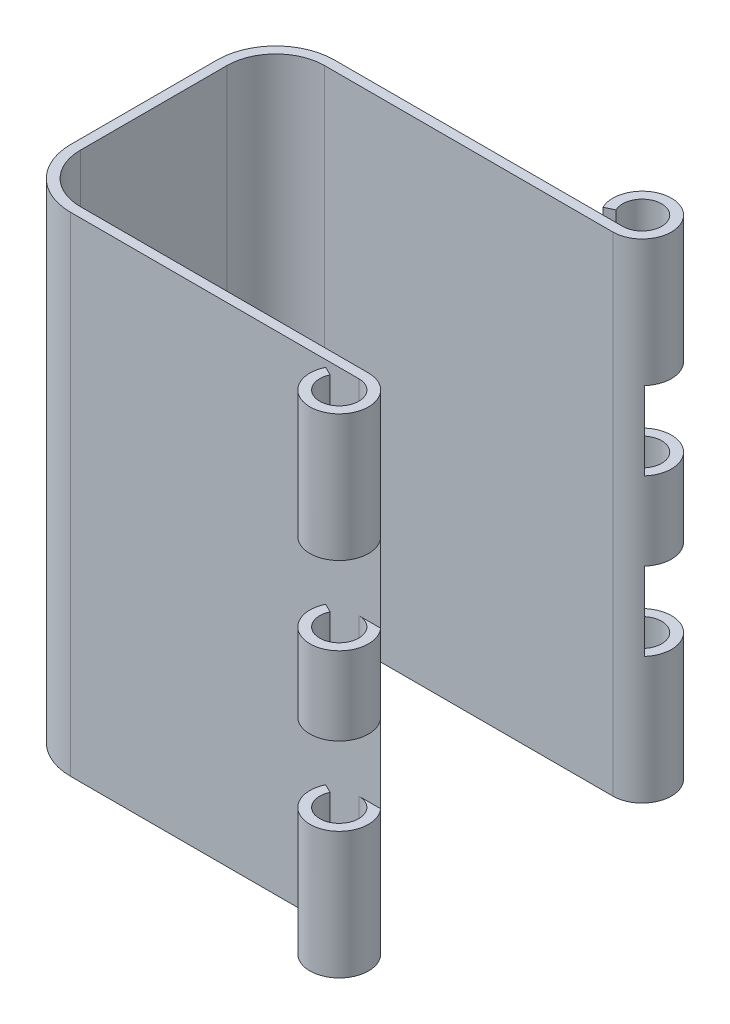
ISO-10303-21;
HEADER;
FILE_DESCRIPTION(('STEP AP214'),'2;1');
FILE_NAME('part.step','',(''),(''),'','','');
FILE_SCHEMA(('AUTOMOTIVE_DESIGN { 1 0 10303 214 1 1 1 1 }'));
ENDSEC;
DATA;
#1=APPLICATION_CONTEXT('core data for automotive mechanical design processes');
#2=APPLICATION_PROTOCOL_DEFINITION('international standard','automotive_design',2000,#1);
#3=PRODUCT_CONTEXT('',#1,'mechanical');
#4=PRODUCT('Part','Part','',(#3));
#5=PRODUCT_RELATED_PRODUCT_CATEGORY('part','',(#4));
#6=PRODUCT_DEFINITION_FORMATION('','',#4);
#7=PRODUCT_DEFINITION_CONTEXT('part definition',#1,'design');
#8=PRODUCT_DEFINITION('design','',#6,#7);
#9=PRODUCT_DEFINITION_SHAPE('','',#8);
#10=(LENGTH_UNIT() NAMED_UNIT(*) SI_UNIT(.MILLI.,.METRE.));
#11=(NAMED_UNIT(*) PLANE_ANGLE_UNIT() SI_UNIT($,.RADIAN.));
#12=(NAMED_UNIT(*) SI_UNIT($,.STERADIAN.) SOLID_ANGLE_UNIT());
#13=UNCERTAINTY_MEASURE_WITH_UNIT(LENGTH_MEASURE(1.E-05),#10,'distance_accuracy_value','');
#14=(GEOMETRIC_REPRESENTATION_CONTEXT(3) GLOBAL_UNCERTAINTY_ASSIGNED_CONTEXT((#13)) GLOBAL_UNIT_ASSIGNED_CONTEXT((#10,
#11,#12)) REPRESENTATION_CONTEXT('',''));
#15=CARTESIAN_POINT('',(0.,0.,0.));
#16=DIRECTION('',(0.,0.,1.));
#17=DIRECTION('',(1.,0.,0.));
#18=AXIS2_PLACEMENT_3D('',#15,#16,#17);
#19=CARTESIAN_POINT('',(8.763,12.7,3.937));
#20=DIRECTION('',(0.,-1.,0.));
#21=DIRECTION('',(0.,0.,-1.));
#22=AXIS2_PLACEMENT_3D('',#19,#20,#21);
#23=CYLINDRICAL_SURFACE('',#22,0.761999999999999);
#24=DIRECTION('',(0.,-1.,0.));
#25=VECTOR('',#24,1.);
#26=CARTESIAN_POINT('',(9.33096126628494,12.7,3.429));
#27=LINE('',#26,#25);
#28=CARTESIAN_POINT('',(9.33096126628494,9.398,3.429));
#29=VERTEX_POINT('',#28);
#30=CARTESIAN_POINT('',(9.33096126628494,7.366,3.429));
#31=VERTEX_POINT('',#30);
#32=EDGE_CURVE('E279',#29,#31,#27,.T.);
#33=ORIENTED_EDGE('',*,*,#32,.T.);
#34=CARTESIAN_POINT('',(8.763,7.366,3.937));
#35=DIRECTION('',(0.,1.,0.));
#36=DIRECTION('',(0.,0.,1.));
#37=AXIS2_PLACEMENT_3D('',#34,#35,#36);
#38=CIRCLE('',#37,0.761999999999999);
#39=CARTESIAN_POINT('',(8.07728874839081,7.366,3.60466872037595));
#40=VERTEX_POINT('',#39);
#41=EDGE_CURVE('E280',#31,#40,#38,.F.);
#42=ORIENTED_EDGE('',*,*,#41,.T.);
#43=DIRECTION('',(0.,-1.,0.));
#44=VECTOR('',#43,1.);
#45=CARTESIAN_POINT('',(8.07728874839081,12.7,3.60466872037595));
#46=LINE('',#45,#44);
#47=CARTESIAN_POINT('',(8.07728874839081,5.334,3.60466872037595));
#48=VERTEX_POINT('',#47);
#49=EDGE_CURVE('E475',#40,#48,#46,.T.);
#50=ORIENTED_EDGE('',*,*,#49,.T.);
#51=CARTESIAN_POINT('',(8.763,5.334,3.937));
#52=DIRECTION('',(0.,-1.,0.));
#53=DIRECTION('',(0.,0.,-1.));
#54=AXIS2_PLACEMENT_3D('',#51,#52,#53);
#55=CIRCLE('',#54,0.761999999999999);
#56=CARTESIAN_POINT('',(9.33096126628494,5.334,3.429));
#57=VERTEX_POINT('',#56);
#58=EDGE_CURVE('E277',#48,#57,#55,.F.);
#59=ORIENTED_EDGE('',*,*,#58,.T.);
#60=DIRECTION('',(0.,-1.,0.));
#61=VECTOR('',#60,1.);
#62=CARTESIAN_POINT('',(9.33096126628494,12.7,3.429));
#63=LINE('',#62,#61);
#64=CARTESIAN_POINT('',(9.33096126628494,3.302,3.429));
#65=VERTEX_POINT('',#64);
#66=EDGE_CURVE('E267',#57,#65,#63,.T.);
#67=ORIENTED_EDGE('',*,*,#66,.T.);
#68=CARTESIAN_POINT('',(8.763,3.302,3.937));
#69=DIRECTION('',(0.,1.,0.));
#70=DIRECTION('',(0.,0.,1.));
#71=AXIS2_PLACEMENT_3D('',#68,#69,#70);
#72=CIRCLE('',#71,0.761999999999999);
#73=CARTESIAN_POINT('',(8.07728874839081,3.302,3.60466872037595));
#74=VERTEX_POINT('',#73);
#75=EDGE_CURVE('E252',#65,#74,#72,.F.);
#76=ORIENTED_EDGE('',*,*,#75,.T.);
#77=CARTESIAN_POINT('',(8.07728874839081,0.,3.60466872037595));
#78=VERTEX_POINT('',#77);
#79=EDGE_CURVE('E410',#74,#78,#46,.T.);
#80=ORIENTED_EDGE('',*,*,#79,.T.);
#81=CARTESIAN_POINT('',(8.763,0.,3.937));
#82=DIRECTION('',(0.,1.,0.));
#83=DIRECTION('',(0.,0.,1.));
#84=AXIS2_PLACEMENT_3D('',#81,#82,#83);
#85=CIRCLE('',#84,0.761999999999999);
#86=CARTESIAN_POINT('',(8.763,0.,3.175));
#87=VERTEX_POINT('',#86);
#88=EDGE_CURVE('E352',#87,#78,#85,.F.);
#89=ORIENTED_EDGE('',*,*,#88,.F.);
#90=DIRECTION('',(0.,-1.,0.));
#91=VECTOR('',#90,1.);
#92=CARTESIAN_POINT('',(8.763,12.7,3.175));
#93=LINE('',#92,#91);
#94=CARTESIAN_POINT('',(8.763,12.7,3.175));
#95=VERTEX_POINT('',#94);
#96=EDGE_CURVE('E533',#95,#87,#93,.T.);
#97=ORIENTED_EDGE('',*,*,#96,.F.);
#98=CARTESIAN_POINT('',(8.763,12.7,3.937));
#99=DIRECTION('',(0.,1.,0.));
#100=DIRECTION('',(0.,0.,1.));
#101=AXIS2_PLACEMENT_3D('',#98,#99,#100);
#102=CIRCLE('',#101,0.761999999999999);
#103=CARTESIAN_POINT('',(8.07728874839081,12.7,3.60466872037595));
#104=VERTEX_POINT('',#103);
#105=EDGE_CURVE('E353',#95,#104,#102,.F.);
#106=ORIENTED_EDGE('',*,*,#105,.T.);
#107=CARTESIAN_POINT('',(8.07728874839081,9.398,3.60466872037595));
#108=VERTEX_POINT('',#107);
#109=EDGE_CURVE('E470',#104,#108,#46,.T.);
#110=ORIENTED_EDGE('',*,*,#109,.T.);
#111=CARTESIAN_POINT('',(8.763,9.398,3.937));
#112=DIRECTION('',(0.,-1.,0.));
#113=DIRECTION('',(0.,0.,-1.));
#114=AXIS2_PLACEMENT_3D('',#111,#112,#113);
#115=CIRCLE('',#114,0.761999999999999);
#116=EDGE_CURVE('E68',#108,#29,#115,.F.);
#117=ORIENTED_EDGE('',*,*,#116,.T.);
#118=EDGE_LOOP('',(#33,#42,#50,#59,#67,#76,#80,#89,#97,#106,#110,#117));
#119=FACE_BOUND('',#118,.T.);
#120=ADVANCED_FACE('F45',(#119),#23,.T.);
#121=CARTESIAN_POINT('',(8.763,12.7,3.937));
#122=DIRECTION('',(0.,-1.,0.));
#123=DIRECTION('',(0.,0.,-1.));
#124=AXIS2_PLACEMENT_3D('',#121,#122,#123);
#125=CYLINDRICAL_SURFACE('',#124,0.508);
#126=CARTESIAN_POINT('',(8.763,7.366,3.937));
#127=DIRECTION('',(0.,1.,0.));
#128=DIRECTION('',(0.,0.,1.));
#129=AXIS2_PLACEMENT_3D('',#126,#127,#128);
#130=CIRCLE('',#129,0.508);
#131=CARTESIAN_POINT('',(8.763,7.366,3.429));
#132=VERTEX_POINT('',#131);
#133=CARTESIAN_POINT('',(8.30585916559387,7.366,3.71544581358397));
#134=VERTEX_POINT('',#133);
#135=EDGE_CURVE('E287',#132,#134,#130,.F.);
#136=ORIENTED_EDGE('',*,*,#135,.F.);
#137=DIRECTION('',(0.,-1.,0.));
#138=VECTOR('',#137,1.);
#139=CARTESIAN_POINT('',(8.763,12.7,3.429));
#140=LINE('',#139,#138);
#141=CARTESIAN_POINT('',(8.763,5.334,3.429));
#142=VERTEX_POINT('',#141);
#143=EDGE_CURVE('E486',#132,#142,#140,.T.);
#144=ORIENTED_EDGE('',*,*,#143,.T.);
#145=CARTESIAN_POINT('',(8.763,5.334,3.937));
#146=DIRECTION('',(0.,-1.,0.));
#147=DIRECTION('',(0.,0.,-1.));
#148=AXIS2_PLACEMENT_3D('',#145,#146,#147);
#149=CIRCLE('',#148,0.508);
#150=CARTESIAN_POINT('',(8.30585916559387,5.334,3.71544581358397));
#151=VERTEX_POINT('',#150);
#152=EDGE_CURVE('E261',#151,#142,#149,.F.);
#153=ORIENTED_EDGE('',*,*,#152,.F.);
#154=DIRECTION('',(0.,-1.,0.));
#155=VECTOR('',#154,1.);
#156=CARTESIAN_POINT('',(8.30585916559387,12.7,3.71544581358397));
#157=LINE('',#156,#155);
#158=EDGE_CURVE('E480',#134,#151,#157,.T.);
#159=ORIENTED_EDGE('',*,*,#158,.F.);
#160=EDGE_LOOP('',(#136,#144,#153,#159));
#161=FACE_BOUND('',#160,.T.);
#162=ADVANCED_FACE('F595',(#161),#125,.F.);
#163=CARTESIAN_POINT('',(8.763,9.398,3.937));
#164=DIRECTION('',(0.,-1.,0.));
#165=DIRECTION('',(0.,0.,-1.));
#166=AXIS2_PLACEMENT_3D('',#163,#164,#165);
#167=CIRCLE('',#166,0.508);
#168=CARTESIAN_POINT('',(8.30585916559387,9.398,3.71544581358397));
#169=VERTEX_POINT('',#168);
#170=CARTESIAN_POINT('',(8.763,9.398,3.429));
#171=VERTEX_POINT('',#170);
#172=EDGE_CURVE('E543',#169,#171,#167,.F.);
#173=ORIENTED_EDGE('',*,*,#172,.F.);
#174=CARTESIAN_POINT('',(8.30585916559387,12.7,3.71544581358397));
#175=VERTEX_POINT('',#174);
#176=EDGE_CURVE('E476',#175,#169,#157,.T.);
#177=ORIENTED_EDGE('',*,*,#176,.F.);
#178=CARTESIAN_POINT('',(8.763,12.7,3.937));
#179=DIRECTION('',(0.,1.,0.));
#180=DIRECTION('',(0.,0.,1.));
#181=AXIS2_PLACEMENT_3D('',#178,#179,#180);
#182=CIRCLE('',#181,0.508);
#183=CARTESIAN_POINT('',(8.763,12.7,3.429));
#184=VERTEX_POINT('',#183);
#185=EDGE_CURVE('E404',#184,#175,#182,.F.);
#186=ORIENTED_EDGE('',*,*,#185,.F.);
#187=EDGE_CURVE('E481',#184,#171,#140,.T.);
#188=ORIENTED_EDGE('',*,*,#187,.T.);
#189=EDGE_LOOP('',(#173,#177,#186,#188));
#190=FACE_BOUND('',#189,.T.);
#191=ADVANCED_FACE('F549',(#190),#125,.F.);
#192=CARTESIAN_POINT('',(8.763,3.302,3.937));
#193=DIRECTION('',(0.,1.,0.));
#194=DIRECTION('',(0.,0.,1.));
#195=AXIS2_PLACEMENT_3D('',#192,#193,#194);
#196=CIRCLE('',#195,0.508);
#197=CARTESIAN_POINT('',(8.763,3.302,3.429));
#198=VERTEX_POINT('',#197);
#199=CARTESIAN_POINT('',(8.30585916559387,3.302,3.71544581358397));
#200=VERTEX_POINT('',#199);
#201=EDGE_CURVE('E60',#198,#200,#196,.F.);
#202=ORIENTED_EDGE('',*,*,#201,.F.);
#203=CARTESIAN_POINT('',(8.763,0.,3.429));
#204=VERTEX_POINT('',#203);
#205=EDGE_CURVE('E270',#198,#204,#140,.T.);
#206=ORIENTED_EDGE('',*,*,#205,.T.);
#207=CARTESIAN_POINT('',(8.763,0.,3.937));
#208=DIRECTION('',(0.,1.,0.));
#209=DIRECTION('',(0.,0.,1.));
#210=AXIS2_PLACEMENT_3D('',#207,#208,#209);
#211=CIRCLE('',#210,0.508);
#212=CARTESIAN_POINT('',(8.30585916559387,0.,3.71544581358397));
#213=VERTEX_POINT('',#212);
#214=EDGE_CURVE('E463',#204,#213,#211,.F.);
#215=ORIENTED_EDGE('',*,*,#214,.T.);
#216=EDGE_CURVE('E474',#200,#213,#157,.T.);
#217=ORIENTED_EDGE('',*,*,#216,.F.);
#218=EDGE_LOOP('',(#202,#206,#215,#217));
#219=FACE_BOUND('',#218,.T.);
#220=ADVANCED_FACE('F604',(#219),#125,.F.);
#221=CARTESIAN_POINT('',(0.121666502853427,12.7,-0.251038933334577));
#222=DIRECTION('',(-0.436130288220536,0.,0.899883532295526));
#223=DIRECTION('',(0.899883532295526,0.,0.436130288220536));
#224=AXIS2_PLACEMENT_3D('',#221,#222,#223);
#225=PLANE('',#224);
#226=DIRECTION('',(-0.899883532295526,0.,-0.436130288220536));
#227=VECTOR('',#226,1.);
#228=CARTESIAN_POINT('',(0.121666502853427,7.366,-0.251038933334577));
#229=LINE('',#228,#227);
#230=EDGE_CURVE('E11',#134,#40,#229,.T.);
#231=ORIENTED_EDGE('',*,*,#230,.F.);
#232=ORIENTED_EDGE('',*,*,#158,.T.);
#233=DIRECTION('',(0.899883532295526,0.,0.436130288220536));
#234=VECTOR('',#233,1.);
#235=CARTESIAN_POINT('',(0.121666502853426,5.334,-0.251038933334578));
#236=LINE('',#235,#234);
#237=EDGE_CURVE('E538',#48,#151,#236,.T.);
#238=ORIENTED_EDGE('',*,*,#237,.F.);
#239=ORIENTED_EDGE('',*,*,#49,.F.);
#240=EDGE_LOOP('',(#231,#232,#238,#239));
#241=FACE_BOUND('',#240,.T.);
#242=ADVANCED_FACE('F592',(#241),#225,.F.);
#243=DIRECTION('',(0.899883532295526,0.,0.436130288220536));
#244=VECTOR('',#243,1.);
#245=CARTESIAN_POINT('',(0.121666502853427,9.398,-0.251038933334577));
#246=LINE('',#245,#244);
#247=EDGE_CURVE('E53',#108,#169,#246,.T.);
#248=ORIENTED_EDGE('',*,*,#247,.F.);
#249=ORIENTED_EDGE('',*,*,#109,.F.);
#250=DIRECTION('',(-0.899883532295526,0.,-0.436130288220536));
#251=VECTOR('',#250,1.);
#252=CARTESIAN_POINT('',(0.121666502853427,12.7,-0.251038933334577));
#253=LINE('',#252,#251);
#254=EDGE_CURVE('E407',#175,#104,#253,.T.);
#255=ORIENTED_EDGE('',*,*,#254,.F.);
#256=ORIENTED_EDGE('',*,*,#176,.T.);
#257=EDGE_LOOP('',(#248,#249,#255,#256));
#258=FACE_BOUND('',#257,.T.);
#259=ADVANCED_FACE('F555',(#258),#225,.F.);
#260=DIRECTION('',(-0.899883532295526,0.,-0.436130288220536));
#261=VECTOR('',#260,1.);
#262=CARTESIAN_POINT('',(0.121666502853427,3.302,-0.251038933334577));
#263=LINE('',#262,#261);
#264=EDGE_CURVE('E256',#200,#74,#263,.T.);
#265=ORIENTED_EDGE('',*,*,#264,.F.);
#266=ORIENTED_EDGE('',*,*,#216,.T.);
#267=DIRECTION('',(-0.899883532295526,0.,-0.436130288220536));
#268=VECTOR('',#267,1.);
#269=CARTESIAN_POINT('',(0.121666502853427,0.,-0.251038933334577));
#270=LINE('',#269,#268);
#271=EDGE_CURVE('E358',#213,#78,#270,.T.);
#272=ORIENTED_EDGE('',*,*,#271,.T.);
#273=ORIENTED_EDGE('',*,*,#79,.F.);
#274=EDGE_LOOP('',(#265,#266,#272,#273));
#275=FACE_BOUND('',#274,.T.);
#276=ADVANCED_FACE('F600',(#275),#225,.F.);
#277=CARTESIAN_POINT('',(0.121666502853427,12.7,0.251038933334577));
#278=DIRECTION('',(0.436130288220536,0.,0.899883532295526));
#279=DIRECTION('',(0.899883532295526,0.,-0.436130288220536));
#280=AXIS2_PLACEMENT_3D('',#277,#278,#279);
#281=PLANE('',#280);
#282=DIRECTION('',(-0.899883532295526,0.,0.436130288220536));
#283=VECTOR('',#282,1.);
#284=CARTESIAN_POINT('',(0.121666502853427,9.398,0.251038933334577));
#285=LINE('',#284,#283);
#286=CARTESIAN_POINT('',(8.30585916559387,9.398,-3.71544581358397));
#287=VERTEX_POINT('',#286);
#288=CARTESIAN_POINT('',(8.07728874839081,9.398,-3.60466872037595));
#289=VERTEX_POINT('',#288);
#290=EDGE_CURVE('E345',#287,#289,#285,.T.);
#291=ORIENTED_EDGE('',*,*,#290,.F.);
#292=DIRECTION('',(0.,-1.,0.));
#293=VECTOR('',#292,1.);
#294=CARTESIAN_POINT('',(8.30585916559387,12.7,-3.71544581358397));
#295=LINE('',#294,#293);
#296=CARTESIAN_POINT('',(8.30585916559387,12.7,-3.71544581358397));
#297=VERTEX_POINT('',#296);
#298=EDGE_CURVE('E507',#297,#287,#295,.T.);
#299=ORIENTED_EDGE('',*,*,#298,.F.);
#300=DIRECTION('',(-0.899883532295526,0.,0.436130288220536));
#301=VECTOR('',#300,1.);
#302=CARTESIAN_POINT('',(0.121666502853427,12.7,0.251038933334577));
#303=LINE('',#302,#301);
#304=CARTESIAN_POINT('',(8.07728874839081,12.7,-3.60466872037595));
#305=VERTEX_POINT('',#304);
#306=EDGE_CURVE('E381',#297,#305,#303,.T.);
#307=ORIENTED_EDGE('',*,*,#306,.T.);
#308=DIRECTION('',(0.,-1.,0.));
#309=VECTOR('',#308,1.);
#310=CARTESIAN_POINT('',(8.07728874839081,12.7,-3.60466872037595));
#311=LINE('',#310,#309);
#312=EDGE_CURVE('E513',#305,#289,#311,.T.);
#313=ORIENTED_EDGE('',*,*,#312,.T.);
#314=EDGE_LOOP('',(#291,#299,#307,#313));
#315=FACE_BOUND('',#314,.T.);
#316=ADVANCED_FACE('F677',(#315),#281,.T.);
#317=DIRECTION('',(0.899883532295526,0.,-0.436130288220536));
#318=VECTOR('',#317,1.);
#319=CARTESIAN_POINT('',(0.121666502853427,3.302,0.251038933334577));
#320=LINE('',#319,#318);
#321=CARTESIAN_POINT('',(8.07728874839081,3.302,-3.60466872037595));
#322=VERTEX_POINT('',#321);
#323=CARTESIAN_POINT('',(8.30585916559387,3.302,-3.71544581358397));
#324=VERTEX_POINT('',#323);
#325=EDGE_CURVE('E317',#322,#324,#320,.T.);
#326=ORIENTED_EDGE('',*,*,#325,.F.);
#327=CARTESIAN_POINT('',(8.07728874839081,0.,-3.60466872037595));
#328=VERTEX_POINT('',#327);
#329=EDGE_CURVE('E511',#322,#328,#311,.T.);
#330=ORIENTED_EDGE('',*,*,#329,.T.);
#331=DIRECTION('',(-0.899883532295526,0.,0.436130288220536));
#332=VECTOR('',#331,1.);
#333=CARTESIAN_POINT('',(0.121666502853427,0.,0.251038933334577));
#334=LINE('',#333,#332);
#335=CARTESIAN_POINT('',(8.30585916559387,0.,-3.71544581358397));
#336=VERTEX_POINT('',#335);
#337=EDGE_CURVE('E438',#336,#328,#334,.T.);
#338=ORIENTED_EDGE('',*,*,#337,.F.);
#339=EDGE_CURVE('E505',#324,#336,#295,.T.);
#340=ORIENTED_EDGE('',*,*,#339,.F.);
#341=EDGE_LOOP('',(#326,#330,#338,#340));
#342=FACE_BOUND('',#341,.T.);
#343=ADVANCED_FACE('F681',(#342),#281,.T.);
#344=CARTESIAN_POINT('',(8.763,12.7,-3.937));
#345=DIRECTION('',(0.,-1.,0.));
#346=DIRECTION('',(0.,0.,-1.));
#347=AXIS2_PLACEMENT_3D('',#344,#345,#346);
#348=CYLINDRICAL_SURFACE('',#347,0.508);
#349=CARTESIAN_POINT('',(8.763,9.398,-3.937));
#350=DIRECTION('',(0.,1.,0.));
#351=DIRECTION('',(0.,0.,1.));
#352=AXIS2_PLACEMENT_3D('',#349,#350,#351);
#353=CIRCLE('',#352,0.508);
#354=CARTESIAN_POINT('',(8.763,9.398,-3.429));
#355=VERTEX_POINT('',#354);
#356=EDGE_CURVE('E342',#355,#287,#353,.T.);
#357=ORIENTED_EDGE('',*,*,#356,.F.);
#358=DIRECTION('',(0.,-1.,0.));
#359=VECTOR('',#358,1.);
#360=CARTESIAN_POINT('',(8.763,12.7,-3.429));
#361=LINE('',#360,#359);
#362=CARTESIAN_POINT('',(8.763,12.7,-3.429));
#363=VERTEX_POINT('',#362);
#364=EDGE_CURVE('E501',#363,#355,#361,.T.);
#365=ORIENTED_EDGE('',*,*,#364,.F.);
#366=CARTESIAN_POINT('',(8.763,12.7,-3.937));
#367=DIRECTION('',(0.,1.,0.));
#368=DIRECTION('',(0.,0.,1.));
#369=AXIS2_PLACEMENT_3D('',#366,#367,#368);
#370=CIRCLE('',#369,0.508);
#371=EDGE_CURVE('E385',#363,#297,#370,.T.);
#372=ORIENTED_EDGE('',*,*,#371,.T.);
#373=ORIENTED_EDGE('',*,*,#298,.T.);
#374=EDGE_LOOP('',(#357,#365,#372,#373));
#375=FACE_BOUND('',#374,.T.);
#376=ADVANCED_FACE('F687',(#375),#348,.F.);
#377=CARTESIAN_POINT('',(8.763,3.302,-3.937));
#378=DIRECTION('',(0.,-1.,0.));
#379=DIRECTION('',(0.,0.,-1.));
#380=AXIS2_PLACEMENT_3D('',#377,#378,#379);
#381=CIRCLE('',#380,0.508);
#382=CARTESIAN_POINT('',(8.763,3.302,-3.429));
#383=VERTEX_POINT('',#382);
#384=EDGE_CURVE('E314',#324,#383,#381,.T.);
#385=ORIENTED_EDGE('',*,*,#384,.F.);
#386=ORIENTED_EDGE('',*,*,#339,.T.);
#387=CARTESIAN_POINT('',(8.763,0.,-3.937));
#388=DIRECTION('',(0.,1.,0.));
#389=DIRECTION('',(0.,0.,1.));
#390=AXIS2_PLACEMENT_3D('',#387,#388,#389);
#391=CIRCLE('',#390,0.508);
#392=CARTESIAN_POINT('',(8.763,0.,-3.429));
#393=VERTEX_POINT('',#392);
#394=EDGE_CURVE('E442',#393,#336,#391,.T.);
#395=ORIENTED_EDGE('',*,*,#394,.F.);
#396=EDGE_CURVE('E500',#383,#393,#361,.T.);
#397=ORIENTED_EDGE('',*,*,#396,.F.);
#398=EDGE_LOOP('',(#385,#386,#395,#397));
#399=FACE_BOUND('',#398,.T.);
#400=ADVANCED_FACE('F697',(#399),#348,.F.);
#401=CARTESIAN_POINT('',(0.,12.7,3.175));
#402=DIRECTION('',(0.,0.,-1.));
#403=DIRECTION('',(-1.,0.,0.));
#404=AXIS2_PLACEMENT_3D('',#401,#402,#403);
#405=PLANE('',#404);
#406=DIRECTION('',(1.,0.,0.));
#407=VECTOR('',#406,1.);
#408=CARTESIAN_POINT('',(0.,0.,3.175));
#409=LINE('',#408,#407);
#410=CARTESIAN_POINT('',(1.27,0.,3.175));
#411=VERTEX_POINT('',#410);
#412=EDGE_CURVE('E414',#411,#87,#409,.T.);
#413=ORIENTED_EDGE('',*,*,#412,.F.);
#414=DIRECTION('',(0.,-1.,0.));
#415=VECTOR('',#414,1.);
#416=CARTESIAN_POINT('',(1.27,12.7,3.175));
#417=LINE('',#416,#415);
#418=CARTESIAN_POINT('',(1.27,12.7,3.175));
#419=VERTEX_POINT('',#418);
#420=EDGE_CURVE('E530',#419,#411,#417,.T.);
#421=ORIENTED_EDGE('',*,*,#420,.F.);
#422=DIRECTION('',(1.,0.,0.));
#423=VECTOR('',#422,1.);
#424=CARTESIAN_POINT('',(0.,12.7,3.175));
#425=LINE('',#424,#423);
#426=EDGE_CURVE('E357',#419,#95,#425,.T.);
#427=ORIENTED_EDGE('',*,*,#426,.T.);
#428=ORIENTED_EDGE('',*,*,#96,.T.);
#429=EDGE_LOOP('',(#413,#421,#427,#428));
#430=FACE_BOUND('',#429,.T.);
#431=ADVANCED_FACE('F715',(#430),#405,.T.);
#432=CARTESIAN_POINT('',(1.27,12.7,1.905));
#433=DIRECTION('',(0.,-1.,0.));
#434=DIRECTION('',(0.,0.,-1.));
#435=AXIS2_PLACEMENT_3D('',#432,#433,#434);
#436=CYLINDRICAL_SURFACE('',#435,1.27);
#437=CARTESIAN_POINT('',(1.27,0.,1.905));
#438=DIRECTION('',(0.,1.,0.));
#439=DIRECTION('',(0.,0.,1.));
#440=AXIS2_PLACEMENT_3D('',#437,#438,#439);
#441=CIRCLE('',#440,1.27);
#442=CARTESIAN_POINT('',(0.,0.,1.905));
#443=VERTEX_POINT('',#442);
#444=EDGE_CURVE('E418',#443,#411,#441,.T.);
#445=ORIENTED_EDGE('',*,*,#444,.F.);
#446=DIRECTION('',(0.,-1.,0.));
#447=VECTOR('',#446,1.);
#448=CARTESIAN_POINT('',(0.,12.7,1.905));
#449=LINE('',#448,#447);
#450=CARTESIAN_POINT('',(0.,12.7,1.905));
#451=VERTEX_POINT('',#450);
#452=EDGE_CURVE('E527',#451,#443,#449,.T.);
#453=ORIENTED_EDGE('',*,*,#452,.F.);
#454=CARTESIAN_POINT('',(1.27,12.7,1.905));
#455=DIRECTION('',(0.,1.,0.));
#456=DIRECTION('',(0.,0.,1.));
#457=AXIS2_PLACEMENT_3D('',#454,#455,#456);
#458=CIRCLE('',#457,1.27);
#459=EDGE_CURVE('E362',#451,#419,#458,.T.);
#460=ORIENTED_EDGE('',*,*,#459,.T.);
#461=ORIENTED_EDGE('',*,*,#420,.T.);
#462=EDGE_LOOP('',(#445,#453,#460,#461));
#463=FACE_BOUND('',#462,.T.);
#464=ADVANCED_FACE('F712',(#463),#436,.F.);
#465=CARTESIAN_POINT('',(0.,12.7,0.));
#466=DIRECTION('',(1.,0.,0.));
#467=DIRECTION('',(0.,0.,-1.));
#468=AXIS2_PLACEMENT_3D('',#465,#466,#467);
#469=PLANE('',#468);
#470=DIRECTION('',(0.,0.,1.));
#471=VECTOR('',#470,1.);
#472=CARTESIAN_POINT('',(0.,0.,0.));
#473=LINE('',#472,#471);
#474=CARTESIAN_POINT('',(0.,0.,-1.905));
#475=VERTEX_POINT('',#474);
#476=EDGE_CURVE('E422',#475,#443,#473,.T.);
#477=ORIENTED_EDGE('',*,*,#476,.F.);
#478=DIRECTION('',(0.,-1.,0.));
#479=VECTOR('',#478,1.);
#480=CARTESIAN_POINT('',(0.,12.7,-1.905));
#481=LINE('',#480,#479);
#482=CARTESIAN_POINT('',(0.,12.7,-1.905));
#483=VERTEX_POINT('',#482);
#484=EDGE_CURVE('E524',#483,#475,#481,.T.);
#485=ORIENTED_EDGE('',*,*,#484,.F.);
#486=DIRECTION('',(0.,0.,1.));
#487=VECTOR('',#486,1.);
#488=CARTESIAN_POINT('',(0.,12.7,0.));
#489=LINE('',#488,#487);
#490=EDGE_CURVE('E366',#483,#451,#489,.T.);
#491=ORIENTED_EDGE('',*,*,#490,.T.);
#492=ORIENTED_EDGE('',*,*,#452,.T.);
#493=EDGE_LOOP('',(#477,#485,#491,#492));
#494=FACE_BOUND('',#493,.T.);
#495=ADVANCED_FACE('F708',(#494),#469,.T.);
#496=CARTESIAN_POINT('',(1.27,12.7,-1.905));
#497=DIRECTION('',(0.,-1.,0.));
#498=DIRECTION('',(0.,0.,-1.));
#499=AXIS2_PLACEMENT_3D('',#496,#497,#498);
#500=CYLINDRICAL_SURFACE('',#499,1.27);
#501=CARTESIAN_POINT('',(1.27,0.,-1.905));
#502=DIRECTION('',(0.,1.,0.));
#503=DIRECTION('',(0.,0.,1.));
#504=AXIS2_PLACEMENT_3D('',#501,#502,#503);
#505=CIRCLE('',#504,1.27);
#506=CARTESIAN_POINT('',(1.27,0.,-3.175));
#507=VERTEX_POINT('',#506);
#508=EDGE_CURVE('E426',#507,#475,#505,.T.);
#509=ORIENTED_EDGE('',*,*,#508,.F.);
#510=DIRECTION('',(0.,-1.,0.));
#511=VECTOR('',#510,1.);
#512=CARTESIAN_POINT('',(1.27,12.7,-3.175));
#513=LINE('',#512,#511);
#514=CARTESIAN_POINT('',(1.27,12.7,-3.175));
#515=VERTEX_POINT('',#514);
#516=EDGE_CURVE('E521',#515,#507,#513,.T.);
#517=ORIENTED_EDGE('',*,*,#516,.F.);
#518=CARTESIAN_POINT('',(1.27,12.7,-1.905));
#519=DIRECTION('',(0.,1.,0.));
#520=DIRECTION('',(0.,0.,1.));
#521=AXIS2_PLACEMENT_3D('',#518,#519,#520);
#522=CIRCLE('',#521,1.27);
#523=EDGE_CURVE('E370',#515,#483,#522,.T.);
#524=ORIENTED_EDGE('',*,*,#523,.T.);
#525=ORIENTED_EDGE('',*,*,#484,.T.);
#526=EDGE_LOOP('',(#509,#517,#524,#525));
#527=FACE_BOUND('',#526,.T.);
#528=ADVANCED_FACE('F702',(#527),#500,.F.);
#529=CARTESIAN_POINT('',(0.,12.7,-3.175));
#530=DIRECTION('',(0.,0.,1.));
#531=DIRECTION('',(1.,0.,0.));
#532=AXIS2_PLACEMENT_3D('',#529,#530,#531);
#533=PLANE('',#532);
#534=DIRECTION('',(-1.,0.,0.));
#535=VECTOR('',#534,1.);
#536=CARTESIAN_POINT('',(0.,0.,-3.175));
#537=LINE('',#536,#535);
#538=CARTESIAN_POINT('',(8.763,0.,-3.175));
#539=VERTEX_POINT('',#538);
#540=EDGE_CURVE('E430',#539,#507,#537,.T.);
#541=ORIENTED_EDGE('',*,*,#540,.F.);
#542=DIRECTION('',(0.,-1.,0.));
#543=VECTOR('',#542,1.);
#544=CARTESIAN_POINT('',(8.763,12.7,-3.175));
#545=LINE('',#544,#543);
#546=CARTESIAN_POINT('',(8.763,12.7,-3.175));
#547=VERTEX_POINT('',#546);
#548=EDGE_CURVE('E517',#547,#539,#545,.T.);
#549=ORIENTED_EDGE('',*,*,#548,.F.);
#550=DIRECTION('',(-1.,0.,0.));
#551=VECTOR('',#550,1.);
#552=CARTESIAN_POINT('',(0.,12.7,-3.175));
#553=LINE('',#552,#551);
#554=EDGE_CURVE('E374',#547,#515,#553,.T.);
#555=ORIENTED_EDGE('',*,*,#554,.T.);
#556=ORIENTED_EDGE('',*,*,#516,.T.);
#557=EDGE_LOOP('',(#541,#549,#555,#556));
#558=FACE_BOUND('',#557,.T.);
#559=ADVANCED_FACE('F698',(#558),#533,.T.);
#560=CARTESIAN_POINT('',(8.763,12.7,-3.937));
#561=DIRECTION('',(0.,-1.,0.));
#562=DIRECTION('',(0.,0.,-1.));
#563=AXIS2_PLACEMENT_3D('',#560,#561,#562);
#564=CYLINDRICAL_SURFACE('',#563,0.761999999999999);
#565=DIRECTION('',(0.,-1.,0.));
#566=VECTOR('',#565,1.);
#567=CARTESIAN_POINT('',(9.33096126628495,12.7,-3.429));
#568=LINE('',#567,#566);
#569=CARTESIAN_POINT('',(9.33096126628495,7.366,-3.429));
#570=VERTEX_POINT('',#569);
#571=CARTESIAN_POINT('',(9.33096126628495,9.398,-3.429));
#572=VERTEX_POINT('',#571);
#573=EDGE_CURVE('E338',#570,#572,#568,.F.);
#574=ORIENTED_EDGE('',*,*,#573,.T.);
#575=CARTESIAN_POINT('',(8.763,9.398,-3.937));
#576=DIRECTION('',(0.,1.,0.));
#577=DIRECTION('',(0.,0.,1.));
#578=AXIS2_PLACEMENT_3D('',#575,#576,#577);
#579=CIRCLE('',#578,0.761999999999999);
#580=EDGE_CURVE('E348',#572,#289,#579,.T.);
#581=ORIENTED_EDGE('',*,*,#580,.T.);
#582=ORIENTED_EDGE('',*,*,#312,.F.);
#583=CARTESIAN_POINT('',(8.763,12.7,-3.937));
#584=DIRECTION('',(0.,1.,0.));
#585=DIRECTION('',(0.,0.,1.));
#586=AXIS2_PLACEMENT_3D('',#583,#584,#585);
#587=CIRCLE('',#586,0.761999999999999);
#588=EDGE_CURVE('E378',#547,#305,#587,.T.);
#589=ORIENTED_EDGE('',*,*,#588,.F.);
#590=ORIENTED_EDGE('',*,*,#548,.T.);
#591=CARTESIAN_POINT('',(8.763,0.,-3.937));
#592=DIRECTION('',(0.,1.,0.));
#593=DIRECTION('',(0.,0.,1.));
#594=AXIS2_PLACEMENT_3D('',#591,#592,#593);
#595=CIRCLE('',#594,0.761999999999999);
#596=EDGE_CURVE('E434',#539,#328,#595,.T.);
#597=ORIENTED_EDGE('',*,*,#596,.T.);
#598=ORIENTED_EDGE('',*,*,#329,.F.);
#599=CARTESIAN_POINT('',(8.763,3.302,-3.937));
#600=DIRECTION('',(0.,-1.,0.));
#601=DIRECTION('',(0.,0.,-1.));
#602=AXIS2_PLACEMENT_3D('',#599,#600,#601);
#603=CIRCLE('',#602,0.761999999999999);
#604=CARTESIAN_POINT('',(9.33096126628495,3.302,-3.429));
#605=VERTEX_POINT('',#604);
#606=EDGE_CURVE('E320',#322,#605,#603,.T.);
#607=ORIENTED_EDGE('',*,*,#606,.T.);
#608=DIRECTION('',(0.,-1.,0.));
#609=VECTOR('',#608,1.);
#610=CARTESIAN_POINT('',(9.33096126628495,12.7,-3.429));
#611=LINE('',#610,#609);
#612=CARTESIAN_POINT('',(9.33096126628495,5.334,-3.429));
#613=VERTEX_POINT('',#612);
#614=EDGE_CURVE('E324',#605,#613,#611,.F.);
#615=ORIENTED_EDGE('',*,*,#614,.T.);
#616=CARTESIAN_POINT('',(8.763,5.334,-3.937));
#617=DIRECTION('',(0.,1.,0.));
#618=DIRECTION('',(0.,0.,1.));
#619=AXIS2_PLACEMENT_3D('',#616,#617,#618);
#620=CIRCLE('',#619,0.761999999999999);
#621=CARTESIAN_POINT('',(8.07728874839081,5.334,-3.60466872037595));
#622=VERTEX_POINT('',#621);
#623=EDGE_CURVE('E310',#613,#622,#620,.T.);
#624=ORIENTED_EDGE('',*,*,#623,.T.);
#625=CARTESIAN_POINT('',(8.07728874839081,7.366,-3.60466872037595));
#626=VERTEX_POINT('',#625);
#627=EDGE_CURVE('E518',#626,#622,#311,.T.);
#628=ORIENTED_EDGE('',*,*,#627,.F.);
#629=CARTESIAN_POINT('',(8.763,7.366,-3.937));
#630=DIRECTION('',(0.,-1.,0.));
#631=DIRECTION('',(0.,0.,-1.));
#632=AXIS2_PLACEMENT_3D('',#629,#630,#631);
#633=CIRCLE('',#632,0.761999999999999);
#634=EDGE_CURVE('E334',#626,#570,#633,.T.);
#635=ORIENTED_EDGE('',*,*,#634,.T.);
#636=EDGE_LOOP('',(#574,#581,#582,#589,#590,#597,#598,#607,#615,#624,#628,#635));
#637=FACE_BOUND('',#636,.T.);
#638=ADVANCED_FACE('F630',(#637),#564,.T.);
#639=DIRECTION('',(0.899883532295526,0.,-0.436130288220536));
#640=VECTOR('',#639,1.);
#641=CARTESIAN_POINT('',(0.121666502853427,7.366,0.251038933334577));
#642=LINE('',#641,#640);
#643=CARTESIAN_POINT('',(8.30585916559387,7.366,-3.71544581358397));
#644=VERTEX_POINT('',#643);
#645=EDGE_CURVE('E331',#626,#644,#642,.T.);
#646=ORIENTED_EDGE('',*,*,#645,.F.);
#647=ORIENTED_EDGE('',*,*,#627,.T.);
#648=DIRECTION('',(-0.899883532295526,0.,0.436130288220536));
#649=VECTOR('',#648,1.);
#650=CARTESIAN_POINT('',(0.121666502853426,5.334,0.251038933334578));
#651=LINE('',#650,#649);
#652=CARTESIAN_POINT('',(8.30585916559387,5.334,-3.71544581358397));
#653=VERTEX_POINT('',#652);
#654=EDGE_CURVE('E307',#653,#622,#651,.T.);
#655=ORIENTED_EDGE('',*,*,#654,.F.);
#656=EDGE_CURVE('E512',#644,#653,#295,.T.);
#657=ORIENTED_EDGE('',*,*,#656,.F.);
#658=EDGE_LOOP('',(#646,#647,#655,#657));
#659=FACE_BOUND('',#658,.T.);
#660=ADVANCED_FACE('F627',(#659),#281,.T.);
#661=CARTESIAN_POINT('',(8.763,7.366,-3.937));
#662=DIRECTION('',(0.,-1.,0.));
#663=DIRECTION('',(0.,0.,-1.));
#664=AXIS2_PLACEMENT_3D('',#661,#662,#663);
#665=CIRCLE('',#664,0.508);
#666=CARTESIAN_POINT('',(8.763,7.366,-3.429));
#667=VERTEX_POINT('',#666);
#668=EDGE_CURVE('E328',#644,#667,#665,.T.);
#669=ORIENTED_EDGE('',*,*,#668,.F.);
#670=ORIENTED_EDGE('',*,*,#656,.T.);
#671=CARTESIAN_POINT('',(8.763,5.334,-3.937));
#672=DIRECTION('',(0.,1.,0.));
#673=DIRECTION('',(0.,0.,1.));
#674=AXIS2_PLACEMENT_3D('',#671,#672,#673);
#675=CIRCLE('',#674,0.508);
#676=CARTESIAN_POINT('',(8.763,5.334,-3.429));
#677=VERTEX_POINT('',#676);
#678=EDGE_CURVE('E294',#677,#653,#675,.T.);
#679=ORIENTED_EDGE('',*,*,#678,.F.);
#680=EDGE_CURVE('E506',#667,#677,#361,.T.);
#681=ORIENTED_EDGE('',*,*,#680,.F.);
#682=EDGE_LOOP('',(#669,#670,#679,#681));
#683=FACE_BOUND('',#682,.T.);
#684=ADVANCED_FACE('F642',(#683),#348,.F.);
#685=CARTESIAN_POINT('',(0.,12.7,-3.429));
#686=DIRECTION('',(0.,0.,1.));
#687=DIRECTION('',(1.,0.,0.));
#688=AXIS2_PLACEMENT_3D('',#685,#686,#687);
#689=PLANE('',#688);
#690=DIRECTION('',(-1.,0.,0.));
#691=VECTOR('',#690,1.);
#692=CARTESIAN_POINT('',(0.,0.,-3.429));
#693=LINE('',#692,#691);
#694=CARTESIAN_POINT('',(1.27,0.,-3.429));
#695=VERTEX_POINT('',#694);
#696=EDGE_CURVE('E446',#393,#695,#693,.T.);
#697=ORIENTED_EDGE('',*,*,#696,.T.);
#698=DIRECTION('',(0.,-1.,0.));
#699=VECTOR('',#698,1.);
#700=CARTESIAN_POINT('',(1.27,12.7,-3.429));
#701=LINE('',#700,#699);
#702=CARTESIAN_POINT('',(1.27,12.7,-3.429));
#703=VERTEX_POINT('',#702);
#704=EDGE_CURVE('E497',#703,#695,#701,.T.);
#705=ORIENTED_EDGE('',*,*,#704,.F.);
#706=DIRECTION('',(-1.,0.,0.));
#707=VECTOR('',#706,1.);
#708=CARTESIAN_POINT('',(0.,12.7,-3.429));
#709=LINE('',#708,#707);
#710=EDGE_CURVE('E389',#363,#703,#709,.T.);
#711=ORIENTED_EDGE('',*,*,#710,.F.);
#712=ORIENTED_EDGE('',*,*,#364,.T.);
#713=DIRECTION('',(-1.,0.,0.));
#714=VECTOR('',#713,1.);
#715=CARTESIAN_POINT('',(12.446,9.398,-3.429));
#716=LINE('',#715,#714);
#717=EDGE_CURVE('E291',#572,#355,#716,.T.);
#718=ORIENTED_EDGE('',*,*,#717,.F.);
#719=ORIENTED_EDGE('',*,*,#573,.F.);
#720=DIRECTION('',(-1.,0.,0.));
#721=VECTOR('',#720,1.);
#722=CARTESIAN_POINT('',(12.446,7.366,-3.429));
#723=LINE('',#722,#721);
#724=EDGE_CURVE('E295',#570,#667,#723,.T.);
#725=ORIENTED_EDGE('',*,*,#724,.T.);
#726=ORIENTED_EDGE('',*,*,#680,.T.);
#727=DIRECTION('',(-1.,0.,0.));
#728=VECTOR('',#727,1.);
#729=CARTESIAN_POINT('',(12.446,5.334,-3.429));
#730=LINE('',#729,#728);
#731=EDGE_CURVE('E284',#613,#677,#730,.T.);
#732=ORIENTED_EDGE('',*,*,#731,.F.);
#733=ORIENTED_EDGE('',*,*,#614,.F.);
#734=DIRECTION('',(-1.,0.,0.));
#735=VECTOR('',#734,1.);
#736=CARTESIAN_POINT('',(12.446,3.302,-3.429));
#737=LINE('',#736,#735);
#738=EDGE_CURVE('E299',#605,#383,#737,.T.);
#739=ORIENTED_EDGE('',*,*,#738,.T.);
#740=ORIENTED_EDGE('',*,*,#396,.T.);
#741=EDGE_LOOP('',(#697,#705,#711,#712,#718,#719,#725,#726,#732,#733,#739,#740));
#742=FACE_BOUND('',#741,.T.);
#743=ADVANCED_FACE('F636',(#742),#689,.F.);
#744=CARTESIAN_POINT('',(1.27,12.7,-1.905));
#745=DIRECTION('',(0.,-1.,0.));
#746=DIRECTION('',(0.,0.,-1.));
#747=AXIS2_PLACEMENT_3D('',#744,#745,#746);
#748=CYLINDRICAL_SURFACE('',#747,1.524);
#749=CARTESIAN_POINT('',(1.27,0.,-1.905));
#750=DIRECTION('',(0.,1.,0.));
#751=DIRECTION('',(0.,0.,1.));
#752=AXIS2_PLACEMENT_3D('',#749,#750,#751);
#753=CIRCLE('',#752,1.524);
#754=CARTESIAN_POINT('',(-0.254,0.,-1.905));
#755=VERTEX_POINT('',#754);
#756=EDGE_CURVE('E450',#695,#755,#753,.T.);
#757=ORIENTED_EDGE('',*,*,#756,.T.);
#758=DIRECTION('',(0.,-1.,0.));
#759=VECTOR('',#758,1.);
#760=CARTESIAN_POINT('',(-0.254,12.7,-1.905));
#761=LINE('',#760,#759);
#762=CARTESIAN_POINT('',(-0.254,12.7,-1.905));
#763=VERTEX_POINT('',#762);
#764=EDGE_CURVE('E493',#763,#755,#761,.T.);
#765=ORIENTED_EDGE('',*,*,#764,.F.);
#766=CARTESIAN_POINT('',(1.27,12.7,-1.905));
#767=DIRECTION('',(0.,1.,0.));
#768=DIRECTION('',(0.,0.,1.));
#769=AXIS2_PLACEMENT_3D('',#766,#767,#768);
#770=CIRCLE('',#769,1.524);
#771=EDGE_CURVE('E392',#703,#763,#770,.T.);
#772=ORIENTED_EDGE('',*,*,#771,.F.);
#773=ORIENTED_EDGE('',*,*,#704,.T.);
#774=EDGE_LOOP('',(#757,#765,#772,#773));
#775=FACE_BOUND('',#774,.T.);
#776=ADVANCED_FACE('F746',(#775),#748,.T.);
#777=CARTESIAN_POINT('',(-0.254,12.7,0.));
#778=DIRECTION('',(1.,0.,0.));
#779=DIRECTION('',(0.,0.,-1.));
#780=AXIS2_PLACEMENT_3D('',#777,#778,#779);
#781=PLANE('',#780);
#782=DIRECTION('',(0.,0.,1.));
#783=VECTOR('',#782,1.);
#784=CARTESIAN_POINT('',(-0.254,0.,0.));
#785=LINE('',#784,#783);
#786=CARTESIAN_POINT('',(-0.254,0.,1.905));
#787=VERTEX_POINT('',#786);
#788=EDGE_CURVE('E453',#755,#787,#785,.T.);
#789=ORIENTED_EDGE('',*,*,#788,.T.);
#790=DIRECTION('',(0.,-1.,0.));
#791=VECTOR('',#790,1.);
#792=CARTESIAN_POINT('',(-0.254,12.7,1.905));
#793=LINE('',#792,#791);
#794=CARTESIAN_POINT('',(-0.254,12.7,1.905));
#795=VERTEX_POINT('',#794);
#796=EDGE_CURVE('E489',#795,#787,#793,.T.);
#797=ORIENTED_EDGE('',*,*,#796,.F.);
#798=DIRECTION('',(0.,0.,1.));
#799=VECTOR('',#798,1.);
#800=CARTESIAN_POINT('',(-0.254,12.7,0.));
#801=LINE('',#800,#799);
#802=EDGE_CURVE('E395',#763,#795,#801,.T.);
#803=ORIENTED_EDGE('',*,*,#802,.F.);
#804=ORIENTED_EDGE('',*,*,#764,.T.);
#805=EDGE_LOOP('',(#789,#797,#803,#804));
#806=FACE_BOUND('',#805,.T.);
#807=ADVANCED_FACE('F750',(#806),#781,.F.);
#808=CARTESIAN_POINT('',(1.27,12.7,1.905));
#809=DIRECTION('',(0.,-1.,0.));
#810=DIRECTION('',(0.,0.,-1.));
#811=AXIS2_PLACEMENT_3D('',#808,#809,#810);
#812=CYLINDRICAL_SURFACE('',#811,1.524);
#813=CARTESIAN_POINT('',(1.27,0.,1.905));
#814=DIRECTION('',(0.,1.,0.));
#815=DIRECTION('',(0.,0.,1.));
#816=AXIS2_PLACEMENT_3D('',#813,#814,#815);
#817=CIRCLE('',#816,1.524);
#818=CARTESIAN_POINT('',(1.27,0.,3.429));
#819=VERTEX_POINT('',#818);
#820=EDGE_CURVE('E456',#787,#819,#817,.T.);
#821=ORIENTED_EDGE('',*,*,#820,.T.);
#822=DIRECTION('',(0.,-1.,0.));
#823=VECTOR('',#822,1.);
#824=CARTESIAN_POINT('',(1.27,12.7,3.429));
#825=LINE('',#824,#823);
#826=CARTESIAN_POINT('',(1.27,12.7,3.429));
#827=VERTEX_POINT('',#826);
#828=EDGE_CURVE('E485',#827,#819,#825,.T.);
#829=ORIENTED_EDGE('',*,*,#828,.F.);
#830=CARTESIAN_POINT('',(1.27,12.7,1.905));
#831=DIRECTION('',(0.,1.,0.));
#832=DIRECTION('',(0.,0.,1.));
#833=AXIS2_PLACEMENT_3D('',#830,#831,#832);
#834=CIRCLE('',#833,1.524);
#835=EDGE_CURVE('E398',#795,#827,#834,.T.);
#836=ORIENTED_EDGE('',*,*,#835,.F.);
#837=ORIENTED_EDGE('',*,*,#796,.T.);
#838=EDGE_LOOP('',(#821,#829,#836,#837));
#839=FACE_BOUND('',#838,.T.);
#840=ADVANCED_FACE('F753',(#839),#812,.T.);
#841=CARTESIAN_POINT('',(0.,12.7,3.429));
#842=DIRECTION('',(0.,0.,-1.));
#843=DIRECTION('',(-1.,0.,0.));
#844=AXIS2_PLACEMENT_3D('',#841,#842,#843);
#845=PLANE('',#844);
#846=ORIENTED_EDGE('',*,*,#828,.T.);
#847=DIRECTION('',(1.,0.,0.));
#848=VECTOR('',#847,1.);
#849=CARTESIAN_POINT('',(0.,0.,3.429));
#850=LINE('',#849,#848);
#851=EDGE_CURVE('E460',#819,#204,#850,.T.);
#852=ORIENTED_EDGE('',*,*,#851,.T.);
#853=ORIENTED_EDGE('',*,*,#205,.F.);
#854=DIRECTION('',(-1.,0.,0.));
#855=VECTOR('',#854,1.);
#856=CARTESIAN_POINT('',(12.446,3.302,3.429));
#857=LINE('',#856,#855);
#858=EDGE_CURVE('E255',#65,#198,#857,.T.);
#859=ORIENTED_EDGE('',*,*,#858,.F.);
#860=ORIENTED_EDGE('',*,*,#66,.F.);
#861=DIRECTION('',(-1.,0.,0.));
#862=VECTOR('',#861,1.);
#863=CARTESIAN_POINT('',(12.446,5.334,3.429));
#864=LINE('',#863,#862);
#865=EDGE_CURVE('E272',#57,#142,#864,.T.);
#866=ORIENTED_EDGE('',*,*,#865,.T.);
#867=ORIENTED_EDGE('',*,*,#143,.F.);
#868=DIRECTION('',(-1.,0.,0.));
#869=VECTOR('',#868,1.);
#870=CARTESIAN_POINT('',(12.446,7.366,3.429));
#871=LINE('',#870,#869);
#872=EDGE_CURVE('E566',#31,#132,#871,.T.);
#873=ORIENTED_EDGE('',*,*,#872,.F.);
#874=ORIENTED_EDGE('',*,*,#32,.F.);
#875=DIRECTION('',(-1.,0.,0.));
#876=VECTOR('',#875,1.);
#877=CARTESIAN_POINT('',(12.446,9.398,3.429));
#878=LINE('',#877,#876);
#879=EDGE_CURVE('E563',#29,#171,#878,.T.);
#880=ORIENTED_EDGE('',*,*,#879,.T.);
#881=ORIENTED_EDGE('',*,*,#187,.F.);
#882=DIRECTION('',(1.,0.,0.));
#883=VECTOR('',#882,1.);
#884=CARTESIAN_POINT('',(0.,12.7,3.429));
#885=LINE('',#884,#883);
#886=EDGE_CURVE('E401',#827,#184,#885,.T.);
#887=ORIENTED_EDGE('',*,*,#886,.F.);
#888=EDGE_LOOP('',(#846,#852,#853,#859,#860,#866,#867,#873,#874,#880,#881,#887));
#889=FACE_BOUND('',#888,.T.);
#890=ADVANCED_FACE('F265',(#889),#845,.F.);
#891=CARTESIAN_POINT('',(0.,12.7,0.));
#892=DIRECTION('',(0.,1.,0.));
#893=DIRECTION('',(0.,0.,1.));
#894=AXIS2_PLACEMENT_3D('',#891,#892,#893);
#895=PLANE('',#894);
#896=ORIENTED_EDGE('',*,*,#105,.F.);
#897=ORIENTED_EDGE('',*,*,#426,.F.);
#898=ORIENTED_EDGE('',*,*,#459,.F.);
#899=ORIENTED_EDGE('',*,*,#490,.F.);
#900=ORIENTED_EDGE('',*,*,#523,.F.);
#901=ORIENTED_EDGE('',*,*,#554,.F.);
#902=ORIENTED_EDGE('',*,*,#588,.T.);
#903=ORIENTED_EDGE('',*,*,#306,.F.);
#904=ORIENTED_EDGE('',*,*,#371,.F.);
#905=ORIENTED_EDGE('',*,*,#710,.T.);
#906=ORIENTED_EDGE('',*,*,#771,.T.);
#907=ORIENTED_EDGE('',*,*,#802,.T.);
#908=ORIENTED_EDGE('',*,*,#835,.T.);
#909=ORIENTED_EDGE('',*,*,#886,.T.);
#910=ORIENTED_EDGE('',*,*,#185,.T.);
#911=ORIENTED_EDGE('',*,*,#254,.T.);
#912=EDGE_LOOP('',(#896,#897,#898,#899,#900,#901,#902,#903,#904,#905,#906,#907,#908,#909,#910,#911));
#913=FACE_BOUND('',#912,.T.);
#914=ADVANCED_FACE('F558',(#913),#895,.T.);
#915=CARTESIAN_POINT('',(0.,0.,0.));
#916=DIRECTION('',(0.,1.,0.));
#917=DIRECTION('',(0.,0.,1.));
#918=AXIS2_PLACEMENT_3D('',#915,#916,#917);
#919=PLANE('',#918);
#920=ORIENTED_EDGE('',*,*,#88,.T.);
#921=ORIENTED_EDGE('',*,*,#271,.F.);
#922=ORIENTED_EDGE('',*,*,#214,.F.);
#923=ORIENTED_EDGE('',*,*,#851,.F.);
#924=ORIENTED_EDGE('',*,*,#820,.F.);
#925=ORIENTED_EDGE('',*,*,#788,.F.);
#926=ORIENTED_EDGE('',*,*,#756,.F.);
#927=ORIENTED_EDGE('',*,*,#696,.F.);
#928=ORIENTED_EDGE('',*,*,#394,.T.);
#929=ORIENTED_EDGE('',*,*,#337,.T.);
#930=ORIENTED_EDGE('',*,*,#596,.F.);
#931=ORIENTED_EDGE('',*,*,#540,.T.);
#932=ORIENTED_EDGE('',*,*,#508,.T.);
#933=ORIENTED_EDGE('',*,*,#476,.T.);
#934=ORIENTED_EDGE('',*,*,#444,.T.);
#935=ORIENTED_EDGE('',*,*,#412,.T.);
#936=EDGE_LOOP('',(#920,#921,#922,#923,#924,#925,#926,#927,#928,#929,#930,#931,#932,#933,#934,#935));
#937=FACE_BOUND('',#936,.T.);
#938=ADVANCED_FACE('F607',(#937),#919,.F.);
#939=CARTESIAN_POINT('',(12.446,3.302,-3.429));
#940=DIRECTION('',(0.,-1.,0.));
#941=DIRECTION('',(0.,0.,-1.));
#942=AXIS2_PLACEMENT_3D('',#939,#940,#941);
#943=PLANE('',#942);
#944=ORIENTED_EDGE('',*,*,#325,.T.);
#945=ORIENTED_EDGE('',*,*,#384,.T.);
#946=ORIENTED_EDGE('',*,*,#738,.F.);
#947=ORIENTED_EDGE('',*,*,#606,.F.);
#948=EDGE_LOOP('',(#944,#945,#946,#947));
#949=FACE_BOUND('',#948,.T.);
#950=ADVANCED_FACE('F763',(#949),#943,.F.);
#951=CARTESIAN_POINT('',(12.446,5.334,-3.429));
#952=DIRECTION('',(0.,1.,0.));
#953=DIRECTION('',(0.,0.,1.));
#954=AXIS2_PLACEMENT_3D('',#951,#952,#953);
#955=PLANE('',#954);
#956=ORIENTED_EDGE('',*,*,#731,.T.);
#957=ORIENTED_EDGE('',*,*,#678,.T.);
#958=ORIENTED_EDGE('',*,*,#654,.T.);
#959=ORIENTED_EDGE('',*,*,#623,.F.);
#960=EDGE_LOOP('',(#956,#957,#958,#959));
#961=FACE_BOUND('',#960,.T.);
#962=ADVANCED_FACE('F633',(#961),#955,.F.);
#963=CARTESIAN_POINT('',(12.446,9.398,-5.91742963318148));
#964=DIRECTION('',(0.,1.,0.));
#965=DIRECTION('',(0.,0.,1.));
#966=AXIS2_PLACEMENT_3D('',#963,#964,#965);
#967=PLANE('',#966);
#968=ORIENTED_EDGE('',*,*,#717,.T.);
#969=ORIENTED_EDGE('',*,*,#356,.T.);
#970=ORIENTED_EDGE('',*,*,#290,.T.);
#971=ORIENTED_EDGE('',*,*,#580,.F.);
#972=EDGE_LOOP('',(#968,#969,#970,#971));
#973=FACE_BOUND('',#972,.T.);
#974=ADVANCED_FACE('F647',(#973),#967,.F.);
#975=CARTESIAN_POINT('',(12.446,7.366,-5.91742963318148));
#976=DIRECTION('',(0.,-1.,0.));
#977=DIRECTION('',(0.,0.,-1.));
#978=AXIS2_PLACEMENT_3D('',#975,#976,#977);
#979=PLANE('',#978);
#980=ORIENTED_EDGE('',*,*,#645,.T.);
#981=ORIENTED_EDGE('',*,*,#668,.T.);
#982=ORIENTED_EDGE('',*,*,#724,.F.);
#983=ORIENTED_EDGE('',*,*,#634,.F.);
#984=EDGE_LOOP('',(#980,#981,#982,#983));
#985=FACE_BOUND('',#984,.T.);
#986=ADVANCED_FACE('F644',(#985),#979,.F.);
#987=CARTESIAN_POINT('',(12.446,5.334,3.429));
#988=DIRECTION('',(0.,-1.,0.));
#989=DIRECTION('',(0.,0.,-1.));
#990=AXIS2_PLACEMENT_3D('',#987,#988,#989);
#991=PLANE('',#990);
#992=ORIENTED_EDGE('',*,*,#237,.T.);
#993=ORIENTED_EDGE('',*,*,#152,.T.);
#994=ORIENTED_EDGE('',*,*,#865,.F.);
#995=ORIENTED_EDGE('',*,*,#58,.F.);
#996=EDGE_LOOP('',(#992,#993,#994,#995));
#997=FACE_BOUND('',#996,.T.);
#998=ADVANCED_FACE('F646',(#997),#991,.T.);
#999=CARTESIAN_POINT('',(12.446,3.302,3.429));
#1000=DIRECTION('',(0.,1.,0.));
#1001=DIRECTION('',(0.,0.,1.));
#1002=AXIS2_PLACEMENT_3D('',#999,#1000,#1001);
#1003=PLANE('',#1002);
#1004=ORIENTED_EDGE('',*,*,#858,.T.);
#1005=ORIENTED_EDGE('',*,*,#201,.T.);
#1006=ORIENTED_EDGE('',*,*,#264,.T.);
#1007=ORIENTED_EDGE('',*,*,#75,.F.);
#1008=EDGE_LOOP('',(#1004,#1005,#1006,#1007));
#1009=FACE_BOUND('',#1008,.T.);
#1010=ADVANCED_FACE('F254',(#1009),#1003,.T.);
#1011=CARTESIAN_POINT('',(12.446,7.366,5.91742963318148));
#1012=DIRECTION('',(0.,1.,0.));
#1013=DIRECTION('',(0.,0.,1.));
#1014=AXIS2_PLACEMENT_3D('',#1011,#1012,#1013);
#1015=PLANE('',#1014);
#1016=ORIENTED_EDGE('',*,*,#872,.T.);
#1017=ORIENTED_EDGE('',*,*,#135,.T.);
#1018=ORIENTED_EDGE('',*,*,#230,.T.);
#1019=ORIENTED_EDGE('',*,*,#41,.F.);
#1020=EDGE_LOOP('',(#1016,#1017,#1018,#1019));
#1021=FACE_BOUND('',#1020,.T.);
#1022=ADVANCED_FACE('F584',(#1021),#1015,.T.);
#1023=CARTESIAN_POINT('',(12.446,9.398,5.91742963318148));
#1024=DIRECTION('',(0.,-1.,0.));
#1025=DIRECTION('',(0.,0.,-1.));
#1026=AXIS2_PLACEMENT_3D('',#1023,#1024,#1025);
#1027=PLANE('',#1026);
#1028=ORIENTED_EDGE('',*,*,#247,.T.);
#1029=ORIENTED_EDGE('',*,*,#172,.T.);
#1030=ORIENTED_EDGE('',*,*,#879,.F.);
#1031=ORIENTED_EDGE('',*,*,#116,.F.);
#1032=EDGE_LOOP('',(#1028,#1029,#1030,#1031));
#1033=FACE_BOUND('',#1032,.T.);
#1034=ADVANCED_FACE('F542',(#1033),#1027,.T.);
#1035=CLOSED_SHELL('',(#120,#162,#191,#220,#242,#259,#276,#316,#343,#376,#400,#431,#464,#495,
#528,#559,#638,#660,#684,#743,#776,#807,#840,#890,#914,#938,#950,#962,#974,#986,#998,#1010,
#1022,#1034));
#1036=MANIFOLD_SOLID_BREP('B2',#1035);
#1037=ADVANCED_BREP_SHAPE_REPRESENTATION('',(#18,#1036),#14);
#1038=SHAPE_DEFINITION_REPRESENTATION(#9,#1037);
ENDSEC;
END-ISO-10303-21;
